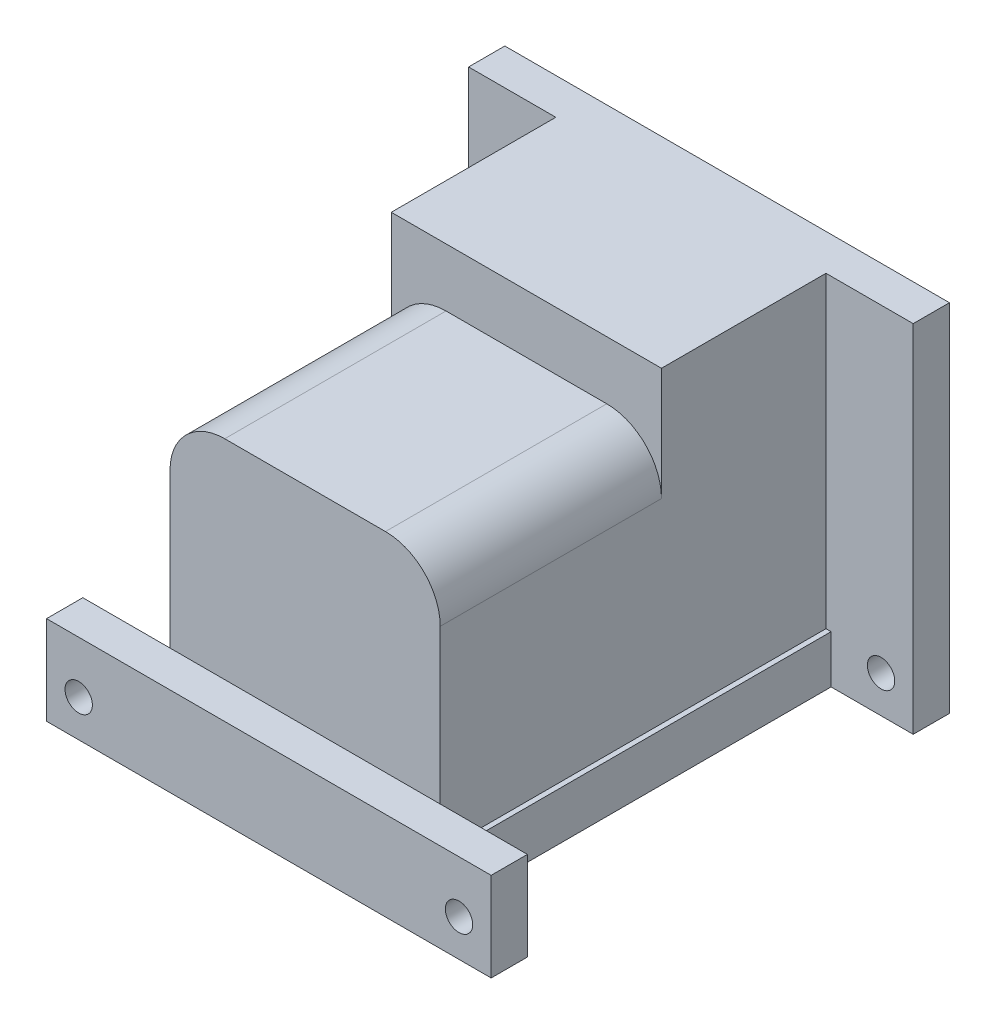
ISO-10303-21;
HEADER;
FILE_DESCRIPTION(('STEP AP214'),'2;1');
FILE_NAME('part.step','',(''),(''),'','','');
FILE_SCHEMA(('AUTOMOTIVE_DESIGN { 1 0 10303 214 1 1 1 1 }'));
ENDSEC;
DATA;
#1=APPLICATION_CONTEXT('core data for automotive mechanical design processes');
#2=APPLICATION_PROTOCOL_DEFINITION('international standard','automotive_design',2000,#1);
#3=PRODUCT_CONTEXT('',#1,'mechanical');
#4=PRODUCT('Part','Part','',(#3));
#5=PRODUCT_RELATED_PRODUCT_CATEGORY('part','',(#4));
#6=PRODUCT_DEFINITION_FORMATION('','',#4);
#7=PRODUCT_DEFINITION_CONTEXT('part definition',#1,'design');
#8=PRODUCT_DEFINITION('design','',#6,#7);
#9=PRODUCT_DEFINITION_SHAPE('','',#8);
#10=(LENGTH_UNIT() NAMED_UNIT(*) SI_UNIT(.MILLI.,.METRE.));
#11=(NAMED_UNIT(*) PLANE_ANGLE_UNIT() SI_UNIT($,.RADIAN.));
#12=(NAMED_UNIT(*) SI_UNIT($,.STERADIAN.) SOLID_ANGLE_UNIT());
#13=UNCERTAINTY_MEASURE_WITH_UNIT(LENGTH_MEASURE(1.E-05),#10,'distance_accuracy_value','');
#14=(GEOMETRIC_REPRESENTATION_CONTEXT(3) GLOBAL_UNCERTAINTY_ASSIGNED_CONTEXT((#13)) GLOBAL_UNIT_ASSIGNED_CONTEXT((#10,
#11,#12)) REPRESENTATION_CONTEXT('',''));
#15=CARTESIAN_POINT('',(0.,0.,0.));
#16=DIRECTION('',(0.,0.,1.));
#17=DIRECTION('',(1.,0.,0.));
#18=AXIS2_PLACEMENT_3D('',#15,#16,#17);
#19=CARTESIAN_POINT('',(20.5,52.,-28.2));
#20=DIRECTION('',(-1.,0.,0.));
#21=DIRECTION('',(0.,0.,1.));
#22=AXIS2_PLACEMENT_3D('',#19,#20,#21);
#23=PLANE('',#22);
#24=DIRECTION('',(0.,0.,-1.));
#25=VECTOR('',#24,1.);
#26=CARTESIAN_POINT('',(20.5,7.,28.2));
#27=LINE('',#26,#25);
#28=CARTESIAN_POINT('',(20.5,7.,28.2));
#29=VERTEX_POINT('',#28);
#30=CARTESIAN_POINT('',(20.5,7.,-28.2));
#31=VERTEX_POINT('',#30);
#32=EDGE_CURVE('E182',#29,#31,#27,.T.);
#33=ORIENTED_EDGE('',*,*,#32,.F.);
#34=DIRECTION('',(0.,-1.,0.));
#35=VECTOR('',#34,1.);
#36=CARTESIAN_POINT('',(20.5,52.,28.2));
#37=LINE('',#36,#35);
#38=CARTESIAN_POINT('',(20.5,0.,28.2));
#39=VERTEX_POINT('',#38);
#40=EDGE_CURVE('E192',#29,#39,#37,.T.);
#41=ORIENTED_EDGE('',*,*,#40,.T.);
#42=DIRECTION('',(0.,0.,-1.));
#43=VECTOR('',#42,1.);
#44=CARTESIAN_POINT('',(20.5,0.,-28.2));
#45=LINE('',#44,#43);
#46=CARTESIAN_POINT('',(20.5,0.,-28.2));
#47=VERTEX_POINT('',#46);
#48=EDGE_CURVE('E372',#39,#47,#45,.T.);
#49=ORIENTED_EDGE('',*,*,#48,.T.);
#50=DIRECTION('',(0.,-1.,0.));
#51=VECTOR('',#50,1.);
#52=CARTESIAN_POINT('',(20.5,52.,-28.2));
#53=LINE('',#52,#51);
#54=EDGE_CURVE('E194',#31,#47,#53,.T.);
#55=ORIENTED_EDGE('',*,*,#54,.F.);
#56=EDGE_LOOP('',(#33,#41,#49,#55));
#57=FACE_BOUND('',#56,.T.);
#58=ADVANCED_FACE('F37',(#57),#23,.F.);
#59=CARTESIAN_POINT('',(-32.5,52.,33.5));
#60=DIRECTION('',(1.,0.,0.));
#61=DIRECTION('',(0.,0.,-1.));
#62=AXIS2_PLACEMENT_3D('',#59,#60,#61);
#63=PLANE('',#62);
#64=DIRECTION('',(0.,0.,1.));
#65=VECTOR('',#64,1.);
#66=CARTESIAN_POINT('',(-32.5,13.,28.2));
#67=LINE('',#66,#65);
#68=CARTESIAN_POINT('',(-32.5,13.,28.2));
#69=VERTEX_POINT('',#68);
#70=CARTESIAN_POINT('',(-32.5,13.,33.5));
#71=VERTEX_POINT('',#70);
#72=EDGE_CURVE('E303',#69,#71,#67,.T.);
#73=ORIENTED_EDGE('',*,*,#72,.F.);
#74=DIRECTION('',(0.,-1.,0.));
#75=VECTOR('',#74,1.);
#76=CARTESIAN_POINT('',(-32.5,52.,28.2));
#77=LINE('',#76,#75);
#78=CARTESIAN_POINT('',(-32.5,0.,28.2));
#79=VERTEX_POINT('',#78);
#80=EDGE_CURVE('E212',#69,#79,#77,.T.);
#81=ORIENTED_EDGE('',*,*,#80,.T.);
#82=DIRECTION('',(0.,0.,1.));
#83=VECTOR('',#82,1.);
#84=CARTESIAN_POINT('',(-32.5,0.,33.5));
#85=LINE('',#84,#83);
#86=CARTESIAN_POINT('',(-32.5,0.,33.5));
#87=VERTEX_POINT('',#86);
#88=EDGE_CURVE('E362',#79,#87,#85,.T.);
#89=ORIENTED_EDGE('',*,*,#88,.T.);
#90=DIRECTION('',(0.,-1.,0.));
#91=VECTOR('',#90,1.);
#92=CARTESIAN_POINT('',(-32.5,52.,33.5));
#93=LINE('',#92,#91);
#94=EDGE_CURVE('E210',#71,#87,#93,.T.);
#95=ORIENTED_EDGE('',*,*,#94,.F.);
#96=EDGE_LOOP('',(#73,#81,#89,#95));
#97=FACE_BOUND('',#96,.T.);
#98=ADVANCED_FACE('F410',(#97),#63,.F.);
#99=CARTESIAN_POINT('',(-32.5,52.,33.5));
#100=DIRECTION('',(0.,0.,-1.));
#101=DIRECTION('',(-1.,0.,0.));
#102=AXIS2_PLACEMENT_3D('',#99,#100,#101);
#103=PLANE('',#102);
#104=CARTESIAN_POINT('',(27.8,5.4,33.5));
#105=DIRECTION('',(0.,0.,1.));
#106=DIRECTION('',(1.,0.,0.));
#107=AXIS2_PLACEMENT_3D('',#104,#105,#106);
#108=CIRCLE('',#107,2.);
#109=CARTESIAN_POINT('',(29.8,5.4,33.5));
#110=VERTEX_POINT('',#109);
#111=EDGE_CURVE('E232',#110,#110,#108,.T.);
#112=ORIENTED_EDGE('',*,*,#111,.F.);
#113=EDGE_LOOP('',(#112));
#114=FACE_BOUND('',#113,.T.);
#115=CARTESIAN_POINT('',(-27.8,5.4,33.5));
#116=DIRECTION('',(0.,0.,1.));
#117=DIRECTION('',(-1.,0.,0.));
#118=AXIS2_PLACEMENT_3D('',#115,#116,#117);
#119=CIRCLE('',#118,2.);
#120=CARTESIAN_POINT('',(-29.8,5.4,33.5));
#121=VERTEX_POINT('',#120);
#122=EDGE_CURVE('E314',#121,#121,#119,.T.);
#123=ORIENTED_EDGE('',*,*,#122,.F.);
#124=EDGE_LOOP('',(#123));
#125=FACE_BOUND('',#124,.T.);
#126=DIRECTION('',(1.,0.,0.));
#127=VECTOR('',#126,1.);
#128=CARTESIAN_POINT('',(-32.5,13.,33.5));
#129=LINE('',#128,#127);
#130=CARTESIAN_POINT('',(32.5,13.,33.5));
#131=VERTEX_POINT('',#130);
#132=EDGE_CURVE('E305',#71,#131,#129,.T.);
#133=ORIENTED_EDGE('',*,*,#132,.F.);
#134=ORIENTED_EDGE('',*,*,#94,.T.);
#135=DIRECTION('',(1.,0.,0.));
#136=VECTOR('',#135,1.);
#137=CARTESIAN_POINT('',(-32.5,0.,33.5));
#138=LINE('',#137,#136);
#139=CARTESIAN_POINT('',(32.5,0.,33.5));
#140=VERTEX_POINT('',#139);
#141=EDGE_CURVE('E365',#87,#140,#138,.T.);
#142=ORIENTED_EDGE('',*,*,#141,.T.);
#143=DIRECTION('',(0.,-1.,0.));
#144=VECTOR('',#143,1.);
#145=CARTESIAN_POINT('',(32.5,52.,33.5));
#146=LINE('',#145,#144);
#147=EDGE_CURVE('E203',#131,#140,#146,.T.);
#148=ORIENTED_EDGE('',*,*,#147,.F.);
#149=EDGE_LOOP('',(#133,#134,#142,#148));
#150=FACE_BOUND('',#149,.T.);
#151=ADVANCED_FACE('F406',(#114,#125,#150),#103,.F.);
#152=CARTESIAN_POINT('',(32.5,52.,33.5));
#153=DIRECTION('',(-1.,0.,0.));
#154=DIRECTION('',(0.,0.,1.));
#155=AXIS2_PLACEMENT_3D('',#152,#153,#154);
#156=PLANE('',#155);
#157=DIRECTION('',(0.,0.,-1.));
#158=VECTOR('',#157,1.);
#159=CARTESIAN_POINT('',(32.5,13.,33.5));
#160=LINE('',#159,#158);
#161=CARTESIAN_POINT('',(32.5,13.,28.2));
#162=VERTEX_POINT('',#161);
#163=EDGE_CURVE('E307',#131,#162,#160,.T.);
#164=ORIENTED_EDGE('',*,*,#163,.F.);
#165=ORIENTED_EDGE('',*,*,#147,.T.);
#166=DIRECTION('',(0.,0.,-1.));
#167=VECTOR('',#166,1.);
#168=CARTESIAN_POINT('',(32.5,0.,33.5));
#169=LINE('',#168,#167);
#170=CARTESIAN_POINT('',(32.5,0.,28.2));
#171=VERTEX_POINT('',#170);
#172=EDGE_CURVE('E368',#140,#171,#169,.T.);
#173=ORIENTED_EDGE('',*,*,#172,.T.);
#174=DIRECTION('',(0.,-1.,0.));
#175=VECTOR('',#174,1.);
#176=CARTESIAN_POINT('',(32.5,52.,28.2));
#177=LINE('',#176,#175);
#178=EDGE_CURVE('E201',#162,#171,#177,.T.);
#179=ORIENTED_EDGE('',*,*,#178,.F.);
#180=EDGE_LOOP('',(#164,#165,#173,#179));
#181=FACE_BOUND('',#180,.T.);
#182=ADVANCED_FACE('F402',(#181),#156,.F.);
#183=CARTESIAN_POINT('',(20.5,52.,28.2));
#184=DIRECTION('',(0.,0.,1.));
#185=DIRECTION('',(1.,0.,0.));
#186=AXIS2_PLACEMENT_3D('',#183,#184,#185);
#187=PLANE('',#186);
#188=CARTESIAN_POINT('',(27.8,5.4,28.2));
#189=DIRECTION('',(0.,0.,1.));
#190=DIRECTION('',(1.,0.,0.));
#191=AXIS2_PLACEMENT_3D('',#188,#189,#190);
#192=CIRCLE('',#191,2.);
#193=CARTESIAN_POINT('',(29.8,5.4,28.2));
#194=VERTEX_POINT('',#193);
#195=EDGE_CURVE('E231',#194,#194,#192,.T.);
#196=ORIENTED_EDGE('',*,*,#195,.T.);
#197=EDGE_LOOP('',(#196));
#198=FACE_BOUND('',#197,.T.);
#199=DIRECTION('',(-1.,0.,0.));
#200=VECTOR('',#199,1.);
#201=CARTESIAN_POINT('',(32.5,13.,28.2));
#202=LINE('',#201,#200);
#203=CARTESIAN_POINT('',(19.75,13.,28.2));
#204=VERTEX_POINT('',#203);
#205=EDGE_CURVE('E302',#162,#204,#202,.T.);
#206=ORIENTED_EDGE('',*,*,#205,.F.);
#207=ORIENTED_EDGE('',*,*,#178,.T.);
#208=DIRECTION('',(-1.,0.,0.));
#209=VECTOR('',#208,1.);
#210=CARTESIAN_POINT('',(20.5,0.,28.2));
#211=LINE('',#210,#209);
#212=EDGE_CURVE('E199',#171,#39,#211,.T.);
#213=ORIENTED_EDGE('',*,*,#212,.T.);
#214=ORIENTED_EDGE('',*,*,#40,.F.);
#215=DIRECTION('',(1.,0.,0.));
#216=VECTOR('',#215,1.);
#217=CARTESIAN_POINT('',(19.75,7.,28.2));
#218=LINE('',#217,#216);
#219=CARTESIAN_POINT('',(19.75,7.,28.2));
#220=VERTEX_POINT('',#219);
#221=EDGE_CURVE('E178',#220,#29,#218,.T.);
#222=ORIENTED_EDGE('',*,*,#221,.F.);
#223=DIRECTION('',(0.,1.,0.));
#224=VECTOR('',#223,1.);
#225=CARTESIAN_POINT('',(19.75,7.,28.2));
#226=LINE('',#225,#224);
#227=EDGE_CURVE('E269',#220,#204,#226,.T.);
#228=ORIENTED_EDGE('',*,*,#227,.T.);
#229=EDGE_LOOP('',(#206,#207,#213,#214,#222,#228));
#230=FACE_BOUND('',#229,.T.);
#231=ADVANCED_FACE('F197',(#198,#230),#187,.F.);
#232=CARTESIAN_POINT('',(-27.8,5.4,28.2));
#233=DIRECTION('',(0.,0.,1.));
#234=DIRECTION('',(1.,0.,0.));
#235=AXIS2_PLACEMENT_3D('',#232,#233,#234);
#236=CIRCLE('',#235,2.);
#237=CARTESIAN_POINT('',(-25.8,5.4,28.2));
#238=VERTEX_POINT('',#237);
#239=EDGE_CURVE('E318',#238,#238,#236,.T.);
#240=ORIENTED_EDGE('',*,*,#239,.T.);
#241=EDGE_LOOP('',(#240));
#242=FACE_BOUND('',#241,.T.);
#243=CARTESIAN_POINT('',(-19.75,13.,28.2));
#244=VERTEX_POINT('',#243);
#245=EDGE_CURVE('E300',#244,#69,#202,.T.);
#246=ORIENTED_EDGE('',*,*,#245,.F.);
#247=DIRECTION('',(0.,1.,0.));
#248=VECTOR('',#247,1.);
#249=CARTESIAN_POINT('',(-19.75,7.,28.2));
#250=LINE('',#249,#248);
#251=CARTESIAN_POINT('',(-19.75,7.,28.2));
#252=VERTEX_POINT('',#251);
#253=EDGE_CURVE('E296',#252,#244,#250,.T.);
#254=ORIENTED_EDGE('',*,*,#253,.F.);
#255=DIRECTION('',(1.,0.,0.));
#256=VECTOR('',#255,1.);
#257=CARTESIAN_POINT('',(-19.75,7.,28.2));
#258=LINE('',#257,#256);
#259=CARTESIAN_POINT('',(-20.5,7.,28.2));
#260=VERTEX_POINT('',#259);
#261=EDGE_CURVE('E282',#260,#252,#258,.T.);
#262=ORIENTED_EDGE('',*,*,#261,.F.);
#263=DIRECTION('',(0.,-1.,0.));
#264=VECTOR('',#263,1.);
#265=CARTESIAN_POINT('',(-20.5,52.,28.2));
#266=LINE('',#265,#264);
#267=CARTESIAN_POINT('',(-20.5,0.,28.2));
#268=VERTEX_POINT('',#267);
#269=EDGE_CURVE('E214',#260,#268,#266,.T.);
#270=ORIENTED_EDGE('',*,*,#269,.T.);
#271=DIRECTION('',(-1.,0.,0.));
#272=VECTOR('',#271,1.);
#273=CARTESIAN_POINT('',(-32.5,0.,28.2));
#274=LINE('',#273,#272);
#275=EDGE_CURVE('E359',#268,#79,#274,.T.);
#276=ORIENTED_EDGE('',*,*,#275,.T.);
#277=ORIENTED_EDGE('',*,*,#80,.F.);
#278=EDGE_LOOP('',(#246,#254,#262,#270,#276,#277));
#279=FACE_BOUND('',#278,.T.);
#280=ADVANCED_FACE('F416',(#242,#279),#187,.F.);
#281=CARTESIAN_POINT('',(32.5,52.,-28.2));
#282=DIRECTION('',(-1.,0.,0.));
#283=DIRECTION('',(0.,0.,1.));
#284=AXIS2_PLACEMENT_3D('',#281,#282,#283);
#285=PLANE('',#284);
#286=DIRECTION('',(0.,0.,-1.));
#287=VECTOR('',#286,1.);
#288=CARTESIAN_POINT('',(32.5,0.,-28.2));
#289=LINE('',#288,#287);
#290=CARTESIAN_POINT('',(32.5,0.,-28.2));
#291=VERTEX_POINT('',#290);
#292=CARTESIAN_POINT('',(32.5,0.,-33.5));
#293=VERTEX_POINT('',#292);
#294=EDGE_CURVE('E334',#291,#293,#289,.T.);
#295=ORIENTED_EDGE('',*,*,#294,.T.);
#296=DIRECTION('',(0.,-1.,0.));
#297=VECTOR('',#296,1.);
#298=CARTESIAN_POINT('',(32.5,52.,-33.5));
#299=LINE('',#298,#297);
#300=CARTESIAN_POINT('',(32.5,52.,-33.5));
#301=VERTEX_POINT('',#300);
#302=EDGE_CURVE('E224',#301,#293,#299,.T.);
#303=ORIENTED_EDGE('',*,*,#302,.F.);
#304=DIRECTION('',(0.,0.,-1.));
#305=VECTOR('',#304,1.);
#306=CARTESIAN_POINT('',(32.5,52.,-28.2));
#307=LINE('',#306,#305);
#308=CARTESIAN_POINT('',(32.5,52.,-28.2));
#309=VERTEX_POINT('',#308);
#310=EDGE_CURVE('E335',#309,#301,#307,.T.);
#311=ORIENTED_EDGE('',*,*,#310,.F.);
#312=DIRECTION('',(0.,-1.,0.));
#313=VECTOR('',#312,1.);
#314=CARTESIAN_POINT('',(32.5,52.,-28.2));
#315=LINE('',#314,#313);
#316=EDGE_CURVE('E205',#309,#291,#315,.T.);
#317=ORIENTED_EDGE('',*,*,#316,.T.);
#318=EDGE_LOOP('',(#295,#303,#311,#317));
#319=FACE_BOUND('',#318,.T.);
#320=ADVANCED_FACE('F379',(#319),#285,.F.);
#321=CARTESIAN_POINT('',(-32.5,52.,-33.5));
#322=DIRECTION('',(0.,0.,1.));
#323=DIRECTION('',(1.,0.,0.));
#324=AXIS2_PLACEMENT_3D('',#321,#322,#323);
#325=PLANE('',#324);
#326=CARTESIAN_POINT('',(-27.8,5.4,-33.5));
#327=DIRECTION('',(0.,0.,1.));
#328=DIRECTION('',(1.,0.,0.));
#329=AXIS2_PLACEMENT_3D('',#326,#327,#328);
#330=CIRCLE('',#329,2.);
#331=CARTESIAN_POINT('',(-25.8,5.4,-33.5));
#332=VERTEX_POINT('',#331);
#333=EDGE_CURVE('E324',#332,#332,#330,.T.);
#334=ORIENTED_EDGE('',*,*,#333,.T.);
#335=EDGE_LOOP('',(#334));
#336=FACE_BOUND('',#335,.T.);
#337=CARTESIAN_POINT('',(27.8,5.4,-33.5));
#338=DIRECTION('',(0.,0.,1.));
#339=DIRECTION('',(1.,0.,0.));
#340=AXIS2_PLACEMENT_3D('',#337,#338,#339);
#341=CIRCLE('',#340,2.);
#342=CARTESIAN_POINT('',(29.8,5.4,-33.5));
#343=VERTEX_POINT('',#342);
#344=EDGE_CURVE('E331',#343,#343,#341,.T.);
#345=ORIENTED_EDGE('',*,*,#344,.T.);
#346=EDGE_LOOP('',(#345));
#347=FACE_BOUND('',#346,.T.);
#348=DIRECTION('',(-1.,0.,0.));
#349=VECTOR('',#348,1.);
#350=CARTESIAN_POINT('',(-32.5,0.,-33.5));
#351=LINE('',#350,#349);
#352=CARTESIAN_POINT('',(-32.5,0.,-33.5));
#353=VERTEX_POINT('',#352);
#354=EDGE_CURVE('E349',#293,#353,#351,.T.);
#355=ORIENTED_EDGE('',*,*,#354,.T.);
#356=DIRECTION('',(0.,-1.,0.));
#357=VECTOR('',#356,1.);
#358=CARTESIAN_POINT('',(-32.5,52.,-33.5));
#359=LINE('',#358,#357);
#360=CARTESIAN_POINT('',(-32.5,52.,-33.5));
#361=VERTEX_POINT('',#360);
#362=EDGE_CURVE('E221',#361,#353,#359,.T.);
#363=ORIENTED_EDGE('',*,*,#362,.F.);
#364=DIRECTION('',(-1.,0.,0.));
#365=VECTOR('',#364,1.);
#366=CARTESIAN_POINT('',(-32.5,52.,-33.5));
#367=LINE('',#366,#365);
#368=EDGE_CURVE('E338',#301,#361,#367,.T.);
#369=ORIENTED_EDGE('',*,*,#368,.F.);
#370=ORIENTED_EDGE('',*,*,#302,.T.);
#371=EDGE_LOOP('',(#355,#363,#369,#370));
#372=FACE_BOUND('',#371,.T.);
#373=ADVANCED_FACE('F389',(#336,#347,#372),#325,.F.);
#374=CARTESIAN_POINT('',(-32.5,52.,-28.2));
#375=DIRECTION('',(1.,0.,0.));
#376=DIRECTION('',(0.,0.,-1.));
#377=AXIS2_PLACEMENT_3D('',#374,#375,#376);
#378=PLANE('',#377);
#379=DIRECTION('',(0.,0.,1.));
#380=VECTOR('',#379,1.);
#381=CARTESIAN_POINT('',(-32.5,0.,-28.2));
#382=LINE('',#381,#380);
#383=CARTESIAN_POINT('',(-32.5,0.,-28.2));
#384=VERTEX_POINT('',#383);
#385=EDGE_CURVE('E351',#353,#384,#382,.T.);
#386=ORIENTED_EDGE('',*,*,#385,.T.);
#387=DIRECTION('',(0.,-1.,0.));
#388=VECTOR('',#387,1.);
#389=CARTESIAN_POINT('',(-32.5,52.,-28.2));
#390=LINE('',#389,#388);
#391=CARTESIAN_POINT('',(-32.5,52.,-28.2));
#392=VERTEX_POINT('',#391);
#393=EDGE_CURVE('E218',#392,#384,#390,.T.);
#394=ORIENTED_EDGE('',*,*,#393,.F.);
#395=DIRECTION('',(0.,0.,1.));
#396=VECTOR('',#395,1.);
#397=CARTESIAN_POINT('',(-32.5,52.,-28.2));
#398=LINE('',#397,#396);
#399=EDGE_CURVE('E341',#361,#392,#398,.T.);
#400=ORIENTED_EDGE('',*,*,#399,.F.);
#401=ORIENTED_EDGE('',*,*,#362,.T.);
#402=EDGE_LOOP('',(#386,#394,#400,#401));
#403=FACE_BOUND('',#402,.T.);
#404=ADVANCED_FACE('F428',(#403),#378,.F.);
#405=CARTESIAN_POINT('',(-20.5,52.,-28.2));
#406=DIRECTION('',(0.,0.,-1.));
#407=DIRECTION('',(-1.,0.,0.));
#408=AXIS2_PLACEMENT_3D('',#405,#406,#407);
#409=PLANE('',#408);
#410=CARTESIAN_POINT('',(-27.8,5.4,-28.2));
#411=DIRECTION('',(0.,0.,-1.));
#412=DIRECTION('',(-1.,0.,0.));
#413=AXIS2_PLACEMENT_3D('',#410,#411,#412);
#414=CIRCLE('',#413,2.);
#415=CARTESIAN_POINT('',(-25.8,5.4,-28.2));
#416=VERTEX_POINT('',#415);
#417=EDGE_CURVE('E321',#416,#416,#414,.T.);
#418=ORIENTED_EDGE('',*,*,#417,.T.);
#419=EDGE_LOOP('',(#418));
#420=FACE_BOUND('',#419,.T.);
#421=DIRECTION('',(1.,0.,0.));
#422=VECTOR('',#421,1.);
#423=CARTESIAN_POINT('',(-20.5,0.,-28.2));
#424=LINE('',#423,#422);
#425=CARTESIAN_POINT('',(-20.5,0.,-28.2));
#426=VERTEX_POINT('',#425);
#427=EDGE_CURVE('E353',#384,#426,#424,.T.);
#428=ORIENTED_EDGE('',*,*,#427,.T.);
#429=DIRECTION('',(0.,-1.,0.));
#430=VECTOR('',#429,1.);
#431=CARTESIAN_POINT('',(-20.5,52.,-28.2));
#432=LINE('',#431,#430);
#433=CARTESIAN_POINT('',(-20.5,7.,-28.2));
#434=VERTEX_POINT('',#433);
#435=EDGE_CURVE('E216',#434,#426,#432,.T.);
#436=ORIENTED_EDGE('',*,*,#435,.F.);
#437=DIRECTION('',(-1.,0.,0.));
#438=VECTOR('',#437,1.);
#439=CARTESIAN_POINT('',(-20.5,7.,-28.2));
#440=LINE('',#439,#438);
#441=CARTESIAN_POINT('',(-19.75,7.,-28.2));
#442=VERTEX_POINT('',#441);
#443=EDGE_CURVE('E288',#442,#434,#440,.T.);
#444=ORIENTED_EDGE('',*,*,#443,.F.);
#445=DIRECTION('',(0.,1.,0.));
#446=VECTOR('',#445,1.);
#447=CARTESIAN_POINT('',(-19.75,7.,-28.2));
#448=LINE('',#447,#446);
#449=CARTESIAN_POINT('',(-19.75,52.,-28.2));
#450=VERTEX_POINT('',#449);
#451=EDGE_CURVE('E293',#442,#450,#448,.T.);
#452=ORIENTED_EDGE('',*,*,#451,.T.);
#453=DIRECTION('',(1.,0.,0.));
#454=VECTOR('',#453,1.);
#455=CARTESIAN_POINT('',(-20.5,52.,-28.2));
#456=LINE('',#455,#454);
#457=EDGE_CURVE('E343',#392,#450,#456,.T.);
#458=ORIENTED_EDGE('',*,*,#457,.F.);
#459=ORIENTED_EDGE('',*,*,#393,.T.);
#460=EDGE_LOOP('',(#428,#436,#444,#452,#458,#459));
#461=FACE_BOUND('',#460,.T.);
#462=ADVANCED_FACE('F424',(#420,#461),#409,.F.);
#463=CARTESIAN_POINT('',(-20.5,52.,28.2));
#464=DIRECTION('',(1.,0.,0.));
#465=DIRECTION('',(0.,0.,-1.));
#466=AXIS2_PLACEMENT_3D('',#463,#464,#465);
#467=PLANE('',#466);
#468=ORIENTED_EDGE('',*,*,#269,.F.);
#469=DIRECTION('',(0.,0.,1.));
#470=VECTOR('',#469,1.);
#471=CARTESIAN_POINT('',(-20.5,7.,28.2));
#472=LINE('',#471,#470);
#473=EDGE_CURVE('E279',#434,#260,#472,.T.);
#474=ORIENTED_EDGE('',*,*,#473,.F.);
#475=ORIENTED_EDGE('',*,*,#435,.T.);
#476=DIRECTION('',(0.,0.,1.));
#477=VECTOR('',#476,1.);
#478=CARTESIAN_POINT('',(-20.5,0.,28.2));
#479=LINE('',#478,#477);
#480=EDGE_CURVE('E356',#426,#268,#479,.T.);
#481=ORIENTED_EDGE('',*,*,#480,.T.);
#482=EDGE_LOOP('',(#468,#474,#475,#481));
#483=FACE_BOUND('',#482,.T.);
#484=ADVANCED_FACE('F420',(#483),#467,.F.);
#485=CARTESIAN_POINT('',(32.5,52.,-28.2));
#486=DIRECTION('',(0.,0.,-1.));
#487=DIRECTION('',(-1.,0.,0.));
#488=AXIS2_PLACEMENT_3D('',#485,#486,#487);
#489=PLANE('',#488);
#490=CARTESIAN_POINT('',(27.8,5.4,-28.2));
#491=DIRECTION('',(0.,0.,-1.));
#492=DIRECTION('',(-1.,0.,0.));
#493=AXIS2_PLACEMENT_3D('',#490,#491,#492);
#494=CIRCLE('',#493,2.);
#495=CARTESIAN_POINT('',(29.8,5.4,-28.2));
#496=VERTEX_POINT('',#495);
#497=EDGE_CURVE('E228',#496,#496,#494,.T.);
#498=ORIENTED_EDGE('',*,*,#497,.T.);
#499=EDGE_LOOP('',(#498));
#500=FACE_BOUND('',#499,.T.);
#501=DIRECTION('',(1.,0.,0.));
#502=VECTOR('',#501,1.);
#503=CARTESIAN_POINT('',(32.5,0.,-28.2));
#504=LINE('',#503,#502);
#505=EDGE_CURVE('E339',#47,#291,#504,.T.);
#506=ORIENTED_EDGE('',*,*,#505,.T.);
#507=ORIENTED_EDGE('',*,*,#316,.F.);
#508=DIRECTION('',(1.,0.,0.));
#509=VECTOR('',#508,1.);
#510=CARTESIAN_POINT('',(32.5,52.,-28.2));
#511=LINE('',#510,#509);
#512=CARTESIAN_POINT('',(19.75,52.,-28.2));
#513=VERTEX_POINT('',#512);
#514=EDGE_CURVE('E345',#513,#309,#511,.T.);
#515=ORIENTED_EDGE('',*,*,#514,.F.);
#516=DIRECTION('',(0.,1.,0.));
#517=VECTOR('',#516,1.);
#518=CARTESIAN_POINT('',(19.75,7.,-28.2));
#519=LINE('',#518,#517);
#520=CARTESIAN_POINT('',(19.75,7.,-28.2));
#521=VERTEX_POINT('',#520);
#522=EDGE_CURVE('E270',#521,#513,#519,.T.);
#523=ORIENTED_EDGE('',*,*,#522,.F.);
#524=DIRECTION('',(-1.,0.,0.));
#525=VECTOR('',#524,1.);
#526=CARTESIAN_POINT('',(20.5,7.,-28.2));
#527=LINE('',#526,#525);
#528=EDGE_CURVE('E195',#31,#521,#527,.T.);
#529=ORIENTED_EDGE('',*,*,#528,.F.);
#530=ORIENTED_EDGE('',*,*,#54,.T.);
#531=EDGE_LOOP('',(#506,#507,#515,#523,#529,#530));
#532=FACE_BOUND('',#531,.T.);
#533=ADVANCED_FACE('F394',(#500,#532),#489,.F.);
#534=CARTESIAN_POINT('',(0.,52.,0.));
#535=DIRECTION('',(0.,-1.,0.));
#536=DIRECTION('',(0.,0.,-1.));
#537=AXIS2_PLACEMENT_3D('',#534,#535,#536);
#538=PLANE('',#537);
#539=DIRECTION('',(-1.,0.,0.));
#540=VECTOR('',#539,1.);
#541=CARTESIAN_POINT('',(20.5,52.,-4.15000000000001));
#542=LINE('',#541,#540);
#543=CARTESIAN_POINT('',(19.75,52.,-4.15000000000002));
#544=VERTEX_POINT('',#543);
#545=CARTESIAN_POINT('',(-19.75,52.,-4.15000000000001));
#546=VERTEX_POINT('',#545);
#547=EDGE_CURVE('E310',#544,#546,#542,.T.);
#548=ORIENTED_EDGE('',*,*,#547,.F.);
#549=DIRECTION('',(0.,0.,1.));
#550=VECTOR('',#549,1.);
#551=CARTESIAN_POINT('',(19.75,52.,-28.2));
#552=LINE('',#551,#550);
#553=EDGE_CURVE('E188',#513,#544,#552,.T.);
#554=ORIENTED_EDGE('',*,*,#553,.F.);
#555=ORIENTED_EDGE('',*,*,#514,.T.);
#556=ORIENTED_EDGE('',*,*,#310,.T.);
#557=ORIENTED_EDGE('',*,*,#368,.T.);
#558=ORIENTED_EDGE('',*,*,#399,.T.);
#559=ORIENTED_EDGE('',*,*,#457,.T.);
#560=DIRECTION('',(0.,0.,-1.));
#561=VECTOR('',#560,1.);
#562=CARTESIAN_POINT('',(-19.75,52.,-28.2));
#563=LINE('',#562,#561);
#564=EDGE_CURVE('E278',#546,#450,#563,.T.);
#565=ORIENTED_EDGE('',*,*,#564,.F.);
#566=EDGE_LOOP('',(#548,#554,#555,#556,#557,#558,#559,#565));
#567=FACE_BOUND('',#566,.T.);
#568=ADVANCED_FACE('F392',(#567),#538,.F.);
#569=CARTESIAN_POINT('',(0.,0.,0.));
#570=DIRECTION('',(0.,-1.,0.));
#571=DIRECTION('',(0.,0.,-1.));
#572=AXIS2_PLACEMENT_3D('',#569,#570,#571);
#573=PLANE('',#572);
#574=ORIENTED_EDGE('',*,*,#294,.F.);
#575=ORIENTED_EDGE('',*,*,#505,.F.);
#576=ORIENTED_EDGE('',*,*,#48,.F.);
#577=ORIENTED_EDGE('',*,*,#212,.F.);
#578=ORIENTED_EDGE('',*,*,#172,.F.);
#579=ORIENTED_EDGE('',*,*,#141,.F.);
#580=ORIENTED_EDGE('',*,*,#88,.F.);
#581=ORIENTED_EDGE('',*,*,#275,.F.);
#582=ORIENTED_EDGE('',*,*,#480,.F.);
#583=ORIENTED_EDGE('',*,*,#427,.F.);
#584=ORIENTED_EDGE('',*,*,#385,.F.);
#585=ORIENTED_EDGE('',*,*,#354,.F.);
#586=EDGE_LOOP('',(#574,#575,#576,#577,#578,#579,#580,#581,#582,#583,#584,#585));
#587=FACE_BOUND('',#586,.T.);
#588=ADVANCED_FACE('F384',(#587),#573,.T.);
#589=CARTESIAN_POINT('',(27.8,5.4,-66.5));
#590=DIRECTION('',(0.,0.,1.));
#591=DIRECTION('',(1.,0.,0.));
#592=AXIS2_PLACEMENT_3D('',#589,#590,#591);
#593=CYLINDRICAL_SURFACE('',#592,2.);
#594=CARTESIAN_POINT('',(29.8,5.4,-28.2));
#595=CARTESIAN_POINT('',(29.8,5.4,-28.2552083333333));
#596=CARTESIAN_POINT('',(29.8,5.4,-28.3104166666667));
#597=CARTESIAN_POINT('',(29.8,5.4,-28.4208333333333));
#598=CARTESIAN_POINT('',(29.8,5.4,-28.4760416666667));
#599=CARTESIAN_POINT('',(29.8,5.4,-28.5864583333334));
#600=CARTESIAN_POINT('',(29.8,5.4,-28.6416666666667));
#601=CARTESIAN_POINT('',(29.8,5.4,-28.7520833333333));
#602=CARTESIAN_POINT('',(29.8,5.4,-28.8072916666667));
#603=CARTESIAN_POINT('',(29.8,5.4,-28.9177083333333));
#604=CARTESIAN_POINT('',(29.8,5.4,-28.9729166666667));
#605=CARTESIAN_POINT('',(29.8,5.4,-29.0833333333333));
#606=CARTESIAN_POINT('',(29.8,5.4,-29.1385416666667));
#607=CARTESIAN_POINT('',(29.8,5.4,-29.2489583333333));
#608=CARTESIAN_POINT('',(29.8,5.4,-29.3041666666667));
#609=CARTESIAN_POINT('',(29.8,5.4,-29.4145833333333));
#610=CARTESIAN_POINT('',(29.8,5.4,-29.4697916666667));
#611=CARTESIAN_POINT('',(29.8,5.4,-29.5802083333333));
#612=CARTESIAN_POINT('',(29.8,5.4,-29.6354166666667));
#613=CARTESIAN_POINT('',(29.8,5.4,-29.7458333333333));
#614=CARTESIAN_POINT('',(29.8,5.4,-29.8010416666667));
#615=CARTESIAN_POINT('',(29.8,5.4,-29.9114583333333));
#616=CARTESIAN_POINT('',(29.8,5.4,-29.9666666666667));
#617=CARTESIAN_POINT('',(29.8,5.4,-30.0770833333333));
#618=CARTESIAN_POINT('',(29.8,5.4,-30.1322916666667));
#619=CARTESIAN_POINT('',(29.8,5.4,-30.2427083333333));
#620=CARTESIAN_POINT('',(29.8,5.4,-30.2979166666667));
#621=CARTESIAN_POINT('',(29.8,5.4,-30.4083333333333));
#622=CARTESIAN_POINT('',(29.8,5.4,-30.4635416666667));
#623=CARTESIAN_POINT('',(29.8,5.4,-30.5739583333333));
#624=CARTESIAN_POINT('',(29.8,5.4,-30.6291666666667));
#625=CARTESIAN_POINT('',(29.8,5.4,-30.7395833333333));
#626=CARTESIAN_POINT('',(29.8,5.4,-30.7947916666667));
#627=CARTESIAN_POINT('',(29.8,5.4,-30.9052083333333));
#628=CARTESIAN_POINT('',(29.8,5.4,-30.9604166666667));
#629=CARTESIAN_POINT('',(29.8,5.4,-31.0708333333333));
#630=CARTESIAN_POINT('',(29.8,5.4,-31.1260416666667));
#631=CARTESIAN_POINT('',(29.8,5.4,-31.2364583333333));
#632=CARTESIAN_POINT('',(29.8,5.4,-31.2916666666667));
#633=CARTESIAN_POINT('',(29.8,5.4,-31.4020833333333));
#634=CARTESIAN_POINT('',(29.8,5.4,-31.4572916666667));
#635=CARTESIAN_POINT('',(29.8,5.4,-31.5677083333333));
#636=CARTESIAN_POINT('',(29.8,5.4,-31.6229166666667));
#637=CARTESIAN_POINT('',(29.8,5.4,-31.7333333333333));
#638=CARTESIAN_POINT('',(29.8,5.4,-31.7885416666667));
#639=CARTESIAN_POINT('',(29.8,5.4,-31.8989583333333));
#640=CARTESIAN_POINT('',(29.8,5.4,-31.9541666666667));
#641=CARTESIAN_POINT('',(29.8,5.4,-32.0645833333333));
#642=CARTESIAN_POINT('',(29.8,5.4,-32.1197916666667));
#643=CARTESIAN_POINT('',(29.8,5.4,-32.2302083333333));
#644=CARTESIAN_POINT('',(29.8,5.4,-32.2854166666667));
#645=CARTESIAN_POINT('',(29.8,5.4,-32.3958333333333));
#646=CARTESIAN_POINT('',(29.8,5.4,-32.4510416666667));
#647=CARTESIAN_POINT('',(29.8,5.4,-32.5614583333333));
#648=CARTESIAN_POINT('',(29.8,5.4,-32.6166666666667));
#649=CARTESIAN_POINT('',(29.8,5.4,-32.7270833333333));
#650=CARTESIAN_POINT('',(29.8,5.4,-32.7822916666667));
#651=CARTESIAN_POINT('',(29.8,5.4,-32.8927083333333));
#652=CARTESIAN_POINT('',(29.8,5.4,-32.9479166666667));
#653=CARTESIAN_POINT('',(29.8,5.4,-33.0583333333333));
#654=CARTESIAN_POINT('',(29.8,5.4,-33.1135416666667));
#655=CARTESIAN_POINT('',(29.8,5.4,-33.2239583333333));
#656=CARTESIAN_POINT('',(29.8,5.4,-33.2791666666667));
#657=CARTESIAN_POINT('',(29.8,5.4,-33.3895833333333));
#658=CARTESIAN_POINT('',(29.8,5.4,-33.4447916666667));
#659=CARTESIAN_POINT('',(29.8,5.4,-33.5));
#660=B_SPLINE_CURVE_WITH_KNOTS('',3,(#594,#595,#596,#597,#598,#599,#600,#601,#602,#603,#604,
#605,#606,#607,#608,#609,#610,#611,#612,#613,#614,#615,#616,#617,#618,#619,#620,#621,#622,#623,
#624,#625,#626,#627,#628,#629,#630,#631,#632,#633,#634,#635,#636,#637,#638,#639,#640,#641,#642,
#643,#644,#645,#646,#647,#648,#649,#650,#651,#652,#653,#654,#655,#656,#657,#658,#659),
.UNSPECIFIED.,.F.,.F.,(4,2,2,2,2,2,2,2,2,2,2,2,2,2,2,2,2,2,2,2,2,2,2,2,2,2,2,2,2,2,2,2,4),(0.,
0.165625000000003,0.331249999999998,0.496875000000001,0.662499999999996,0.828124999999999,
0.993749999999995,1.159375,1.32499999999999,1.490625,1.65625,1.82187499999999,1.9875,
2.15312499999999,2.31874999999999,2.48437499999999,2.64999999999999,2.815625,2.98124999999999,
3.14687499999999,3.31249999999999,3.47812499999999,3.64374999999999,3.80937499999999,
3.97499999999999,4.14062499999999,4.30624999999999,4.47187499999999,4.63749999999999,
4.80312499999998,4.96874999999999,5.13437499999998,5.29999999999999),.UNSPECIFIED.);
#661=EDGE_CURVE('BSEAM621',#496,#343,#660,.T.);
#662=ORIENTED_EDGE('',*,*,#497,.F.);
#663=ORIENTED_EDGE('',*,*,#344,.F.);
#664=ORIENTED_EDGE('',*,*,#661,.T.);
#665=ORIENTED_EDGE('',*,*,#661,.F.);
#666=EDGE_LOOP('',(#662,#664,#663,#665));
#667=FACE_BOUND('',#666,.T.);
#668=ADVANCED_FACE('F621',(#667),#593,.F.);
#669=ORIENTED_EDGE('',*,*,#111,.T.);
#670=EDGE_LOOP('',(#669));
#671=FACE_BOUND('',#670,.T.);
#672=ORIENTED_EDGE('',*,*,#195,.F.);
#673=EDGE_LOOP('',(#672));
#674=FACE_BOUND('',#673,.T.);
#675=ADVANCED_FACE('F628',(#671,#674),#593,.F.);
#676=CARTESIAN_POINT('',(-27.8,5.4,-66.5));
#677=DIRECTION('',(0.,0.,1.));
#678=DIRECTION('',(1.,0.,0.));
#679=AXIS2_PLACEMENT_3D('',#676,#677,#678);
#680=CYLINDRICAL_SURFACE('',#679,2.);
#681=ORIENTED_EDGE('',*,*,#122,.T.);
#682=EDGE_LOOP('',(#681));
#683=FACE_BOUND('',#682,.T.);
#684=ORIENTED_EDGE('',*,*,#239,.F.);
#685=EDGE_LOOP('',(#684));
#686=FACE_BOUND('',#685,.T.);
#687=ADVANCED_FACE('F636',(#683,#686),#680,.F.);
#688=CARTESIAN_POINT('',(-25.8,5.4,-28.2));
#689=CARTESIAN_POINT('',(-25.8,5.4,-28.2552083333333));
#690=CARTESIAN_POINT('',(-25.8,5.4,-28.3104166666667));
#691=CARTESIAN_POINT('',(-25.8,5.4,-28.4208333333333));
#692=CARTESIAN_POINT('',(-25.8,5.4,-28.4760416666667));
#693=CARTESIAN_POINT('',(-25.8,5.4,-28.5864583333333));
#694=CARTESIAN_POINT('',(-25.8,5.4,-28.6416666666667));
#695=CARTESIAN_POINT('',(-25.8,5.4,-28.7520833333333));
#696=CARTESIAN_POINT('',(-25.8,5.4,-28.8072916666667));
#697=CARTESIAN_POINT('',(-25.8,5.4,-28.9177083333333));
#698=CARTESIAN_POINT('',(-25.8,5.4,-28.9729166666667));
#699=CARTESIAN_POINT('',(-25.8,5.4,-29.0833333333333));
#700=CARTESIAN_POINT('',(-25.8,5.4,-29.1385416666667));
#701=CARTESIAN_POINT('',(-25.8,5.4,-29.2489583333333));
#702=CARTESIAN_POINT('',(-25.8,5.4,-29.3041666666667));
#703=CARTESIAN_POINT('',(-25.8,5.4,-29.4145833333333));
#704=CARTESIAN_POINT('',(-25.8,5.4,-29.4697916666667));
#705=CARTESIAN_POINT('',(-25.8,5.4,-29.5802083333333));
#706=CARTESIAN_POINT('',(-25.8,5.4,-29.6354166666667));
#707=CARTESIAN_POINT('',(-25.8,5.4,-29.7458333333333));
#708=CARTESIAN_POINT('',(-25.8,5.4,-29.8010416666667));
#709=CARTESIAN_POINT('',(-25.8,5.4,-29.9114583333333));
#710=CARTESIAN_POINT('',(-25.8,5.4,-29.9666666666667));
#711=CARTESIAN_POINT('',(-25.8,5.4,-30.0770833333333));
#712=CARTESIAN_POINT('',(-25.8,5.4,-30.1322916666667));
#713=CARTESIAN_POINT('',(-25.8,5.4,-30.2427083333333));
#714=CARTESIAN_POINT('',(-25.8,5.4,-30.2979166666667));
#715=CARTESIAN_POINT('',(-25.8,5.4,-30.4083333333333));
#716=CARTESIAN_POINT('',(-25.8,5.4,-30.4635416666667));
#717=CARTESIAN_POINT('',(-25.8,5.4,-30.5739583333333));
#718=CARTESIAN_POINT('',(-25.8,5.4,-30.6291666666667));
#719=CARTESIAN_POINT('',(-25.8,5.4,-30.7395833333333));
#720=CARTESIAN_POINT('',(-25.8,5.4,-30.7947916666667));
#721=CARTESIAN_POINT('',(-25.8,5.4,-30.9052083333333));
#722=CARTESIAN_POINT('',(-25.8,5.4,-30.9604166666667));
#723=CARTESIAN_POINT('',(-25.8,5.4,-31.0708333333333));
#724=CARTESIAN_POINT('',(-25.8,5.4,-31.1260416666667));
#725=CARTESIAN_POINT('',(-25.8,5.4,-31.2364583333333));
#726=CARTESIAN_POINT('',(-25.8,5.4,-31.2916666666667));
#727=CARTESIAN_POINT('',(-25.8,5.4,-31.4020833333333));
#728=CARTESIAN_POINT('',(-25.8,5.4,-31.4572916666667));
#729=CARTESIAN_POINT('',(-25.8,5.4,-31.5677083333333));
#730=CARTESIAN_POINT('',(-25.8,5.4,-31.6229166666667));
#731=CARTESIAN_POINT('',(-25.8,5.4,-31.7333333333333));
#732=CARTESIAN_POINT('',(-25.8,5.4,-31.7885416666667));
#733=CARTESIAN_POINT('',(-25.8,5.4,-31.8989583333333));
#734=CARTESIAN_POINT('',(-25.8,5.4,-31.9541666666667));
#735=CARTESIAN_POINT('',(-25.8,5.4,-32.0645833333333));
#736=CARTESIAN_POINT('',(-25.8,5.4,-32.1197916666667));
#737=CARTESIAN_POINT('',(-25.8,5.4,-32.2302083333333));
#738=CARTESIAN_POINT('',(-25.8,5.4,-32.2854166666667));
#739=CARTESIAN_POINT('',(-25.8,5.4,-32.3958333333333));
#740=CARTESIAN_POINT('',(-25.8,5.4,-32.4510416666667));
#741=CARTESIAN_POINT('',(-25.8,5.4,-32.5614583333333));
#742=CARTESIAN_POINT('',(-25.8,5.4,-32.6166666666667));
#743=CARTESIAN_POINT('',(-25.8,5.4,-32.7270833333333));
#744=CARTESIAN_POINT('',(-25.8,5.4,-32.7822916666667));
#745=CARTESIAN_POINT('',(-25.8,5.4,-32.8927083333333));
#746=CARTESIAN_POINT('',(-25.8,5.4,-32.9479166666667));
#747=CARTESIAN_POINT('',(-25.8,5.4,-33.0583333333333));
#748=CARTESIAN_POINT('',(-25.8,5.4,-33.1135416666667));
#749=CARTESIAN_POINT('',(-25.8,5.4,-33.2239583333333));
#750=CARTESIAN_POINT('',(-25.8,5.4,-33.2791666666667));
#751=CARTESIAN_POINT('',(-25.8,5.4,-33.3895833333333));
#752=CARTESIAN_POINT('',(-25.8,5.4,-33.4447916666667));
#753=CARTESIAN_POINT('',(-25.8,5.4,-33.5));
#754=B_SPLINE_CURVE_WITH_KNOTS('',3,(#688,#689,#690,#691,#692,#693,#694,#695,#696,#697,#698,
#699,#700,#701,#702,#703,#704,#705,#706,#707,#708,#709,#710,#711,#712,#713,#714,#715,#716,#717,
#718,#719,#720,#721,#722,#723,#724,#725,#726,#727,#728,#729,#730,#731,#732,#733,#734,#735,#736,
#737,#738,#739,#740,#741,#742,#743,#744,#745,#746,#747,#748,#749,#750,#751,#752,#753),
.UNSPECIFIED.,.F.,.F.,(4,2,2,2,2,2,2,2,2,2,2,2,2,2,2,2,2,2,2,2,2,2,2,2,2,2,2,2,2,2,2,2,4),(0.,
0.165625000000003,0.331249999999998,0.496875000000001,0.662499999999996,0.828124999999999,
0.993750000000002,1.159375,1.325,1.490625,1.65625,1.821875,1.9875,2.153125,2.31875,2.484375,
2.65,2.815625,2.98125,3.146875,3.3125,3.478125,3.64375,3.809375,3.975,4.140625,4.30625,4.471875,
4.6375,4.803125,4.96875,5.134375,5.3),.UNSPECIFIED.);
#755=EDGE_CURVE('BSEAM450',#416,#332,#754,.T.);
#756=ORIENTED_EDGE('',*,*,#417,.F.);
#757=ORIENTED_EDGE('',*,*,#333,.F.);
#758=ORIENTED_EDGE('',*,*,#755,.T.);
#759=ORIENTED_EDGE('',*,*,#755,.F.);
#760=EDGE_LOOP('',(#756,#758,#757,#759));
#761=FACE_BOUND('',#760,.T.);
#762=ADVANCED_FACE('F450',(#761),#680,.F.);
#763=CARTESIAN_POINT('',(20.5,43.5,-4.15000000000001));
#764=DIRECTION('',(0.,0.,-1.));
#765=DIRECTION('',(-1.,0.,0.));
#766=AXIS2_PLACEMENT_3D('',#763,#764,#765);
#767=PLANE('',#766);
#768=DIRECTION('',(-1.,0.,0.));
#769=VECTOR('',#768,1.);
#770=CARTESIAN_POINT('',(20.5,43.5,-4.15000000000001));
#771=LINE('',#770,#769);
#772=CARTESIAN_POINT('',(11.75,43.5,-4.15000000000001));
#773=VERTEX_POINT('',#772);
#774=CARTESIAN_POINT('',(-11.75,43.5,-4.15000000000001));
#775=VERTEX_POINT('',#774);
#776=EDGE_CURVE('E252',#773,#775,#771,.T.);
#777=ORIENTED_EDGE('',*,*,#776,.F.);
#778=CARTESIAN_POINT('',(11.75,35.5,-4.15000000000001));
#779=DIRECTION('',(0.,0.,-1.));
#780=DIRECTION('',(-1.,0.,0.));
#781=AXIS2_PLACEMENT_3D('',#778,#779,#780);
#782=CIRCLE('',#781,8.);
#783=CARTESIAN_POINT('',(19.75,35.5,-4.15000000000001));
#784=VERTEX_POINT('',#783);
#785=EDGE_CURVE('E45',#773,#784,#782,.T.);
#786=ORIENTED_EDGE('',*,*,#785,.T.);
#787=DIRECTION('',(0.,1.,0.));
#788=VECTOR('',#787,1.);
#789=CARTESIAN_POINT('',(19.75,43.5,-4.15000000000001));
#790=LINE('',#789,#788);
#791=EDGE_CURVE('E250',#784,#544,#790,.T.);
#792=ORIENTED_EDGE('',*,*,#791,.T.);
#793=ORIENTED_EDGE('',*,*,#547,.T.);
#794=DIRECTION('',(0.,-1.,0.));
#795=VECTOR('',#794,1.);
#796=CARTESIAN_POINT('',(-19.75,43.5,-4.15));
#797=LINE('',#796,#795);
#798=CARTESIAN_POINT('',(-19.75,35.5,-4.15));
#799=VERTEX_POINT('',#798);
#800=EDGE_CURVE('E51',#546,#799,#797,.T.);
#801=ORIENTED_EDGE('',*,*,#800,.T.);
#802=CARTESIAN_POINT('',(-11.75,35.5,-4.15000000000001));
#803=DIRECTION('',(0.,0.,-1.));
#804=DIRECTION('',(-1.,0.,0.));
#805=AXIS2_PLACEMENT_3D('',#802,#803,#804);
#806=CIRCLE('',#805,8.);
#807=EDGE_CURVE('E11',#799,#775,#806,.T.);
#808=ORIENTED_EDGE('',*,*,#807,.T.);
#809=EDGE_LOOP('',(#777,#786,#792,#793,#801,#808));
#810=FACE_BOUND('',#809,.T.);
#811=ADVANCED_FACE('F249',(#810),#767,.F.);
#812=CARTESIAN_POINT('',(0.,43.5,0.));
#813=DIRECTION('',(0.,1.,0.));
#814=DIRECTION('',(0.,0.,1.));
#815=AXIS2_PLACEMENT_3D('',#812,#813,#814);
#816=PLANE('',#815);
#817=DIRECTION('',(1.,0.,0.));
#818=VECTOR('',#817,1.);
#819=CARTESIAN_POINT('',(-20.5,43.5,28.2));
#820=LINE('',#819,#818);
#821=CARTESIAN_POINT('',(-11.75,43.5,28.2));
#822=VERTEX_POINT('',#821);
#823=CARTESIAN_POINT('',(11.75,43.5,28.2));
#824=VERTEX_POINT('',#823);
#825=EDGE_CURVE('E312',#822,#824,#820,.T.);
#826=ORIENTED_EDGE('',*,*,#825,.T.);
#827=DIRECTION('',(0.,0.,1.));
#828=VECTOR('',#827,1.);
#829=CARTESIAN_POINT('',(11.75,43.5,-4.15000000000001));
#830=LINE('',#829,#828);
#831=EDGE_CURVE('E241',#824,#773,#830,.F.);
#832=ORIENTED_EDGE('',*,*,#831,.T.);
#833=ORIENTED_EDGE('',*,*,#776,.T.);
#834=DIRECTION('',(0.,0.,-1.));
#835=VECTOR('',#834,1.);
#836=CARTESIAN_POINT('',(-11.75,43.5,28.2));
#837=LINE('',#836,#835);
#838=EDGE_CURVE('E239',#775,#822,#837,.F.);
#839=ORIENTED_EDGE('',*,*,#838,.T.);
#840=EDGE_LOOP('',(#826,#832,#833,#839));
#841=FACE_BOUND('',#840,.T.);
#842=ADVANCED_FACE('F441',(#841),#816,.T.);
#843=CARTESIAN_POINT('',(32.5,13.,28.2));
#844=DIRECTION('',(0.,0.,-1.));
#845=DIRECTION('',(-1.,0.,0.));
#846=AXIS2_PLACEMENT_3D('',#843,#844,#845);
#847=PLANE('',#846);
#848=CARTESIAN_POINT('',(19.75,35.5,28.2));
#849=VERTEX_POINT('',#848);
#850=EDGE_CURVE('E260',#204,#849,#226,.T.);
#851=ORIENTED_EDGE('',*,*,#850,.T.);
#852=CARTESIAN_POINT('',(11.75,35.5,28.2));
#853=DIRECTION('',(0.,0.,-1.));
#854=DIRECTION('',(-1.,0.,0.));
#855=AXIS2_PLACEMENT_3D('',#852,#853,#854);
#856=CIRCLE('',#855,8.);
#857=EDGE_CURVE('E237',#849,#824,#856,.F.);
#858=ORIENTED_EDGE('',*,*,#857,.T.);
#859=ORIENTED_EDGE('',*,*,#825,.F.);
#860=CARTESIAN_POINT('',(-11.75,35.5,28.2));
#861=DIRECTION('',(0.,0.,-1.));
#862=DIRECTION('',(-1.,0.,0.));
#863=AXIS2_PLACEMENT_3D('',#860,#861,#862);
#864=CIRCLE('',#863,8.);
#865=CARTESIAN_POINT('',(-19.75,35.5,28.2));
#866=VERTEX_POINT('',#865);
#867=EDGE_CURVE('E235',#822,#866,#864,.F.);
#868=ORIENTED_EDGE('',*,*,#867,.T.);
#869=EDGE_CURVE('E290',#244,#866,#250,.T.);
#870=ORIENTED_EDGE('',*,*,#869,.F.);
#871=EDGE_CURVE('E267',#204,#244,#202,.T.);
#872=ORIENTED_EDGE('',*,*,#871,.F.);
#873=EDGE_LOOP('',(#851,#858,#859,#868,#870,#872));
#874=FACE_BOUND('',#873,.T.);
#875=ADVANCED_FACE('F263',(#874),#847,.F.);
#876=CARTESIAN_POINT('',(0.,13.,0.));
#877=DIRECTION('',(0.,1.,0.));
#878=DIRECTION('',(0.,0.,1.));
#879=AXIS2_PLACEMENT_3D('',#876,#877,#878);
#880=PLANE('',#879);
#881=ORIENTED_EDGE('',*,*,#163,.T.);
#882=ORIENTED_EDGE('',*,*,#205,.T.);
#883=ORIENTED_EDGE('',*,*,#871,.T.);
#884=ORIENTED_EDGE('',*,*,#245,.T.);
#885=ORIENTED_EDGE('',*,*,#72,.T.);
#886=ORIENTED_EDGE('',*,*,#132,.T.);
#887=EDGE_LOOP('',(#881,#882,#883,#884,#885,#886));
#888=FACE_BOUND('',#887,.T.);
#889=ADVANCED_FACE('F448',(#888),#880,.T.);
#890=CARTESIAN_POINT('',(-19.75,7.,-28.2));
#891=DIRECTION('',(1.,0.,0.));
#892=DIRECTION('',(0.,0.,-1.));
#893=AXIS2_PLACEMENT_3D('',#890,#891,#892);
#894=PLANE('',#893);
#895=ORIENTED_EDGE('',*,*,#869,.T.);
#896=DIRECTION('',(0.,0.,-1.));
#897=VECTOR('',#896,1.);
#898=CARTESIAN_POINT('',(-19.75,35.5,-4.15000000000001));
#899=LINE('',#898,#897);
#900=EDGE_CURVE('E243',#866,#799,#899,.T.);
#901=ORIENTED_EDGE('',*,*,#900,.T.);
#902=ORIENTED_EDGE('',*,*,#800,.F.);
#903=ORIENTED_EDGE('',*,*,#564,.T.);
#904=ORIENTED_EDGE('',*,*,#451,.F.);
#905=DIRECTION('',(0.,0.,-1.));
#906=VECTOR('',#905,1.);
#907=CARTESIAN_POINT('',(-19.75,7.,-28.2));
#908=LINE('',#907,#906);
#909=EDGE_CURVE('E285',#252,#442,#908,.T.);
#910=ORIENTED_EDGE('',*,*,#909,.F.);
#911=ORIENTED_EDGE('',*,*,#253,.T.);
#912=EDGE_LOOP('',(#895,#901,#902,#903,#904,#910,#911));
#913=FACE_BOUND('',#912,.T.);
#914=ADVANCED_FACE('F432',(#913),#894,.F.);
#915=CARTESIAN_POINT('',(0.,7.,0.));
#916=DIRECTION('',(0.,-1.,0.));
#917=DIRECTION('',(0.,0.,-1.));
#918=AXIS2_PLACEMENT_3D('',#915,#916,#917);
#919=PLANE('',#918);
#920=ORIENTED_EDGE('',*,*,#473,.T.);
#921=ORIENTED_EDGE('',*,*,#261,.T.);
#922=ORIENTED_EDGE('',*,*,#909,.T.);
#923=ORIENTED_EDGE('',*,*,#443,.T.);
#924=EDGE_LOOP('',(#920,#921,#922,#923));
#925=FACE_BOUND('',#924,.T.);
#926=ADVANCED_FACE('F435',(#925),#919,.F.);
#927=CARTESIAN_POINT('',(19.75,7.,-28.2));
#928=DIRECTION('',(-1.,0.,0.));
#929=DIRECTION('',(0.,0.,1.));
#930=AXIS2_PLACEMENT_3D('',#927,#928,#929);
#931=PLANE('',#930);
#932=ORIENTED_EDGE('',*,*,#791,.F.);
#933=DIRECTION('',(0.,0.,1.));
#934=VECTOR('',#933,1.);
#935=CARTESIAN_POINT('',(19.75,35.5,28.2));
#936=LINE('',#935,#934);
#937=EDGE_CURVE('E227',#784,#849,#936,.T.);
#938=ORIENTED_EDGE('',*,*,#937,.T.);
#939=ORIENTED_EDGE('',*,*,#850,.F.);
#940=ORIENTED_EDGE('',*,*,#227,.F.);
#941=DIRECTION('',(0.,0.,1.));
#942=VECTOR('',#941,1.);
#943=CARTESIAN_POINT('',(19.75,7.,-28.2));
#944=LINE('',#943,#942);
#945=EDGE_CURVE('E185',#521,#220,#944,.T.);
#946=ORIENTED_EDGE('',*,*,#945,.F.);
#947=ORIENTED_EDGE('',*,*,#522,.T.);
#948=ORIENTED_EDGE('',*,*,#553,.T.);
#949=EDGE_LOOP('',(#932,#938,#939,#940,#946,#947,#948));
#950=FACE_BOUND('',#949,.T.);
#951=ADVANCED_FACE('F259',(#950),#931,.F.);
#952=CARTESIAN_POINT('',(0.,7.,0.));
#953=DIRECTION('',(0.,1.,0.));
#954=DIRECTION('',(0.,0.,1.));
#955=AXIS2_PLACEMENT_3D('',#952,#953,#954);
#956=PLANE('',#955);
#957=ORIENTED_EDGE('',*,*,#221,.T.);
#958=ORIENTED_EDGE('',*,*,#32,.T.);
#959=ORIENTED_EDGE('',*,*,#528,.T.);
#960=ORIENTED_EDGE('',*,*,#945,.T.);
#961=EDGE_LOOP('',(#957,#958,#959,#960));
#962=FACE_BOUND('',#961,.T.);
#963=ADVANCED_FACE('F180',(#962),#956,.T.);
#964=CARTESIAN_POINT('',(11.75,35.5,-28.2));
#965=DIRECTION('',(0.,0.,-1.));
#966=DIRECTION('',(-1.,0.,0.));
#967=AXIS2_PLACEMENT_3D('',#964,#965,#966);
#968=CYLINDRICAL_SURFACE('',#967,8.);
#969=ORIENTED_EDGE('',*,*,#785,.F.);
#970=ORIENTED_EDGE('',*,*,#831,.F.);
#971=ORIENTED_EDGE('',*,*,#857,.F.);
#972=ORIENTED_EDGE('',*,*,#937,.F.);
#973=EDGE_LOOP('',(#969,#970,#971,#972));
#974=FACE_BOUND('',#973,.T.);
#975=ADVANCED_FACE('F255',(#974),#968,.T.);
#976=CARTESIAN_POINT('',(-11.75,35.5,-28.2));
#977=DIRECTION('',(0.,0.,1.));
#978=DIRECTION('',(1.,0.,0.));
#979=AXIS2_PLACEMENT_3D('',#976,#977,#978);
#980=CYLINDRICAL_SURFACE('',#979,8.);
#981=ORIENTED_EDGE('',*,*,#867,.F.);
#982=ORIENTED_EDGE('',*,*,#838,.F.);
#983=ORIENTED_EDGE('',*,*,#807,.F.);
#984=ORIENTED_EDGE('',*,*,#900,.F.);
#985=EDGE_LOOP('',(#981,#982,#983,#984));
#986=FACE_BOUND('',#985,.T.);
#987=ADVANCED_FACE('F39',(#986),#980,.T.);
#988=CLOSED_SHELL('',(#58,#98,#151,#182,#231,#280,#320,#373,#404,#462,#484,#533,#568,#588,#668,
#675,#687,#762,#811,#842,#875,#889,#914,#926,#951,#963,#975,#987));
#989=MANIFOLD_SOLID_BREP('B2',#988);
#990=ADVANCED_BREP_SHAPE_REPRESENTATION('',(#18,#989),#14);
#991=SHAPE_DEFINITION_REPRESENTATION(#9,#990);
ENDSEC;
END-ISO-10303-21;
